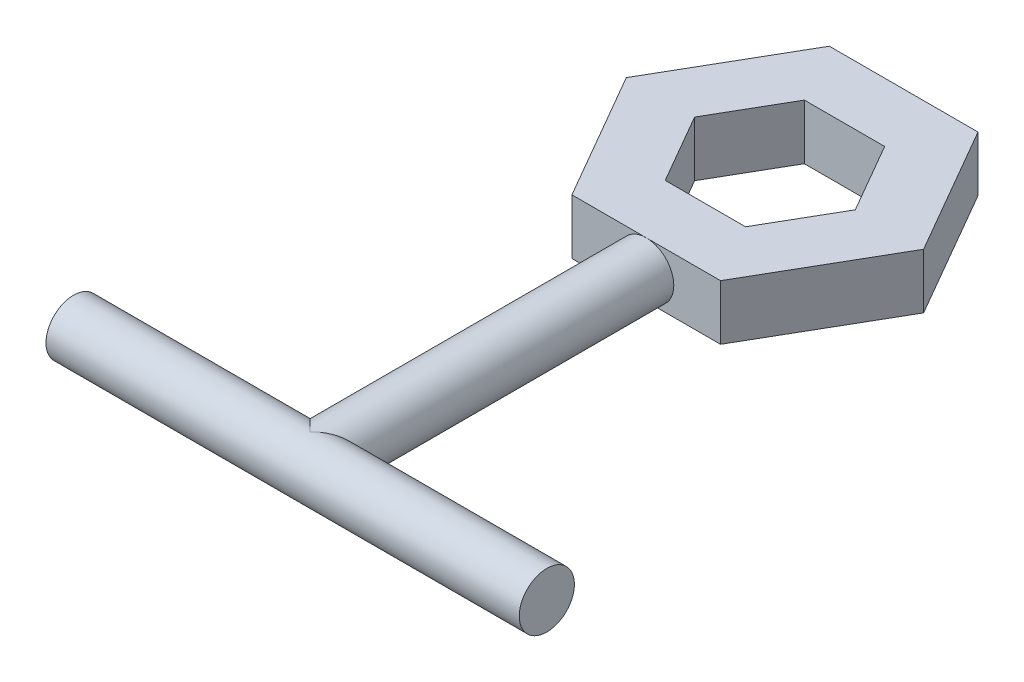
ISO-10303-21;
HEADER;
FILE_DESCRIPTION(('STEP AP214'),'2;1');
FILE_NAME('part.step','',(''),(''),'','','');
FILE_SCHEMA(('AUTOMOTIVE_DESIGN { 1 0 10303 214 1 1 1 1 }'));
ENDSEC;
DATA;
#1=APPLICATION_CONTEXT('core data for automotive mechanical design processes');
#2=APPLICATION_PROTOCOL_DEFINITION('international standard','automotive_design',2000,#1);
#3=PRODUCT_CONTEXT('',#1,'mechanical');
#4=PRODUCT('Part','Part','',(#3));
#5=PRODUCT_RELATED_PRODUCT_CATEGORY('part','',(#4));
#6=PRODUCT_DEFINITION_FORMATION('','',#4);
#7=PRODUCT_DEFINITION_CONTEXT('part definition',#1,'design');
#8=PRODUCT_DEFINITION('design','',#6,#7);
#9=PRODUCT_DEFINITION_SHAPE('','',#8);
#10=(LENGTH_UNIT() NAMED_UNIT(*) SI_UNIT(.MILLI.,.METRE.));
#11=(NAMED_UNIT(*) PLANE_ANGLE_UNIT() SI_UNIT($,.RADIAN.));
#12=(NAMED_UNIT(*) SI_UNIT($,.STERADIAN.) SOLID_ANGLE_UNIT());
#13=UNCERTAINTY_MEASURE_WITH_UNIT(LENGTH_MEASURE(1.E-05),#10,'distance_accuracy_value','');
#14=(GEOMETRIC_REPRESENTATION_CONTEXT(3) GLOBAL_UNCERTAINTY_ASSIGNED_CONTEXT((#13)) GLOBAL_UNIT_ASSIGNED_CONTEXT((#10,
#11,#12)) REPRESENTATION_CONTEXT('',''));
#15=CARTESIAN_POINT('',(0.,0.,0.));
#16=DIRECTION('',(0.,0.,1.));
#17=DIRECTION('',(1.,0.,0.));
#18=AXIS2_PLACEMENT_3D('',#15,#16,#17);
#19=CARTESIAN_POINT('',(-7.97759507955459,2.9591,13.8176));
#20=DIRECTION('',(0.,0.,-1.));
#21=DIRECTION('',(-1.,0.,0.));
#22=AXIS2_PLACEMENT_3D('',#19,#20,#21);
#23=PLANE('',#22);
#24=CARTESIAN_POINT('',(0.,0.,13.8176));
#25=DIRECTION('',(0.,0.,1.));
#26=DIRECTION('',(1.,0.,0.));
#27=AXIS2_PLACEMENT_3D('',#24,#25,#26);
#28=CIRCLE('',#27,2.9591);
#29=CARTESIAN_POINT('',(0.,2.9591,13.8176));
#30=VERTEX_POINT('',#29);
#31=CARTESIAN_POINT('',(0.,-2.9591,13.8176));
#32=VERTEX_POINT('',#31);
#33=EDGE_CURVE('E155',#30,#32,#28,.T.);
#34=ORIENTED_EDGE('',*,*,#33,.F.);
#35=DIRECTION('',(1.,0.,0.));
#36=VECTOR('',#35,1.);
#37=CARTESIAN_POINT('',(-7.97759507955459,2.9591,13.8176));
#38=LINE('',#37,#36);
#39=CARTESIAN_POINT('',(-7.97759507955459,2.9591,13.8176));
#40=VERTEX_POINT('',#39);
#41=EDGE_CURVE('E193',#40,#30,#38,.T.);
#42=ORIENTED_EDGE('',*,*,#41,.F.);
#43=DIRECTION('',(0.,-1.,0.));
#44=VECTOR('',#43,1.);
#45=CARTESIAN_POINT('',(-7.97759507955459,2.9591,13.8176));
#46=LINE('',#45,#44);
#47=CARTESIAN_POINT('',(-7.97759507955459,-2.9591,13.8176));
#48=VERTEX_POINT('',#47);
#49=EDGE_CURVE('E165',#40,#48,#46,.T.);
#50=ORIENTED_EDGE('',*,*,#49,.T.);
#51=DIRECTION('',(1.,0.,0.));
#52=VECTOR('',#51,1.);
#53=CARTESIAN_POINT('',(-7.97759507955459,-2.9591,13.8176));
#54=LINE('',#53,#52);
#55=EDGE_CURVE('E178',#48,#32,#54,.T.);
#56=ORIENTED_EDGE('',*,*,#55,.T.);
#57=EDGE_LOOP('',(#34,#42,#50,#56));
#58=FACE_BOUND('',#57,.T.);
#59=ADVANCED_FACE('F51',(#58),#23,.F.);
#60=CARTESIAN_POINT('',(0.,2.9591,0.));
#61=DIRECTION('',(0.,1.,0.));
#62=DIRECTION('',(0.,0.,1.));
#63=AXIS2_PLACEMENT_3D('',#60,#61,#62);
#64=PLANE('',#63);
#65=DIRECTION('',(-0.5,0.,-0.866025403784439));
#66=VECTOR('',#65,1.);
#67=CARTESIAN_POINT('',(15.9551901591092,2.9591,0.));
#68=LINE('',#67,#66);
#69=CARTESIAN_POINT('',(15.9551901591092,2.9591,0.));
#70=VERTEX_POINT('',#69);
#71=CARTESIAN_POINT('',(7.97759507955457,2.9591,-13.8176));
#72=VERTEX_POINT('',#71);
#73=EDGE_CURVE('E177',#70,#72,#68,.T.);
#74=ORIENTED_EDGE('',*,*,#73,.T.);
#75=DIRECTION('',(-1.,0.,0.));
#76=VECTOR('',#75,1.);
#77=CARTESIAN_POINT('',(7.97759507955457,2.9591,-13.8176));
#78=LINE('',#77,#76);
#79=CARTESIAN_POINT('',(-7.9775950795546,2.9591,-13.8176));
#80=VERTEX_POINT('',#79);
#81=EDGE_CURVE('E200',#72,#80,#78,.T.);
#82=ORIENTED_EDGE('',*,*,#81,.T.);
#83=DIRECTION('',(-0.5,0.,0.866025403784438));
#84=VECTOR('',#83,1.);
#85=CARTESIAN_POINT('',(-7.9775950795546,2.9591,-13.8176));
#86=LINE('',#85,#84);
#87=CARTESIAN_POINT('',(-15.9551901591092,2.9591,0.));
#88=VERTEX_POINT('',#87);
#89=EDGE_CURVE('E198',#80,#88,#86,.T.);
#90=ORIENTED_EDGE('',*,*,#89,.T.);
#91=DIRECTION('',(0.5,0.,0.866025403784439));
#92=VECTOR('',#91,1.);
#93=CARTESIAN_POINT('',(-15.9551901591092,2.9591,0.));
#94=LINE('',#93,#92);
#95=EDGE_CURVE('E196',#88,#40,#94,.T.);
#96=ORIENTED_EDGE('',*,*,#95,.T.);
#97=ORIENTED_EDGE('',*,*,#41,.T.);
#98=CARTESIAN_POINT('',(7.97759507955461,2.9591,13.8176));
#99=VERTEX_POINT('',#98);
#100=EDGE_CURVE('E195',#30,#99,#38,.T.);
#101=ORIENTED_EDGE('',*,*,#100,.T.);
#102=DIRECTION('',(0.5,0.,-0.866025403784439));
#103=VECTOR('',#102,1.);
#104=CARTESIAN_POINT('',(7.97759507955461,2.9591,13.8176));
#105=LINE('',#104,#103);
#106=EDGE_CURVE('E174',#99,#70,#105,.T.);
#107=ORIENTED_EDGE('',*,*,#106,.T.);
#108=EDGE_LOOP('',(#74,#82,#90,#96,#97,#101,#107));
#109=FACE_BOUND('',#108,.T.);
#110=DIRECTION('',(-0.500000000000001,0.,-0.866025403784438));
#111=VECTOR('',#110,1.);
#112=CARTESIAN_POINT('',(8.62284174040091,2.9591,0.));
#113=LINE('',#112,#111);
#114=CARTESIAN_POINT('',(8.62284174040091,2.9591,0.));
#115=VERTEX_POINT('',#114);
#116=CARTESIAN_POINT('',(4.31142087020044,2.9591,-7.46760000000002));
#117=VERTEX_POINT('',#116);
#118=EDGE_CURVE('E245',#115,#117,#113,.T.);
#119=ORIENTED_EDGE('',*,*,#118,.F.);
#120=DIRECTION('',(0.499999999999995,0.,-0.866025403784441));
#121=VECTOR('',#120,1.);
#122=CARTESIAN_POINT('',(4.31142087020054,2.9591,7.46759999999996));
#123=LINE('',#122,#121);
#124=CARTESIAN_POINT('',(4.31142087020054,2.9591,7.46759999999996));
#125=VERTEX_POINT('',#124);
#126=EDGE_CURVE('E221',#125,#115,#123,.T.);
#127=ORIENTED_EDGE('',*,*,#126,.F.);
#128=DIRECTION('',(1.,0.,0.));
#129=VECTOR('',#128,1.);
#130=CARTESIAN_POINT('',(-4.31142087020038,2.9591,7.46760000000004));
#131=LINE('',#130,#129);
#132=CARTESIAN_POINT('',(-4.31142087020038,2.9591,7.46760000000004));
#133=VERTEX_POINT('',#132);
#134=EDGE_CURVE('E217',#133,#125,#131,.T.);
#135=ORIENTED_EDGE('',*,*,#134,.F.);
#136=DIRECTION('',(0.500000000000007,0.,0.866025403784434));
#137=VECTOR('',#136,1.);
#138=CARTESIAN_POINT('',(-8.6228417404009,2.9591,0.));
#139=LINE('',#138,#137);
#140=CARTESIAN_POINT('',(-8.6228417404009,2.9591,0.));
#141=VERTEX_POINT('',#140);
#142=EDGE_CURVE('E238',#141,#133,#139,.T.);
#143=ORIENTED_EDGE('',*,*,#142,.F.);
#144=DIRECTION('',(-0.499999999999995,0.,0.866025403784441));
#145=VECTOR('',#144,1.);
#146=CARTESIAN_POINT('',(-4.31142087020049,2.9591,-7.46759999999999));
#147=LINE('',#146,#145);
#148=CARTESIAN_POINT('',(-4.31142087020049,2.9591,-7.46759999999999));
#149=VERTEX_POINT('',#148);
#150=EDGE_CURVE('E241',#149,#141,#147,.T.);
#151=ORIENTED_EDGE('',*,*,#150,.F.);
#152=DIRECTION('',(-1.,0.,0.));
#153=VECTOR('',#152,1.);
#154=CARTESIAN_POINT('',(4.31142087020044,2.9591,-7.46760000000002));
#155=LINE('',#154,#153);
#156=EDGE_CURVE('E243',#117,#149,#155,.T.);
#157=ORIENTED_EDGE('',*,*,#156,.F.);
#158=EDGE_LOOP('',(#119,#127,#135,#143,#151,#157));
#159=FACE_BOUND('',#158,.T.);
#160=ADVANCED_FACE('F270',(#109,#159),#64,.T.);
#161=CARTESIAN_POINT('',(0.,-2.9591,0.));
#162=DIRECTION('',(0.,1.,0.));
#163=DIRECTION('',(0.,0.,1.));
#164=AXIS2_PLACEMENT_3D('',#161,#162,#163);
#165=PLANE('',#164);
#166=DIRECTION('',(-0.5,0.,-0.866025403784439));
#167=VECTOR('',#166,1.);
#168=CARTESIAN_POINT('',(15.9551901591092,-2.9591,0.));
#169=LINE('',#168,#167);
#170=CARTESIAN_POINT('',(15.9551901591092,-2.9591,0.));
#171=VERTEX_POINT('',#170);
#172=CARTESIAN_POINT('',(7.97759507955457,-2.9591,-13.8176));
#173=VERTEX_POINT('',#172);
#174=EDGE_CURVE('E188',#171,#173,#169,.T.);
#175=ORIENTED_EDGE('',*,*,#174,.F.);
#176=DIRECTION('',(0.5,0.,-0.866025403784439));
#177=VECTOR('',#176,1.);
#178=CARTESIAN_POINT('',(7.97759507955461,-2.9591,13.8176));
#179=LINE('',#178,#177);
#180=CARTESIAN_POINT('',(7.97759507955461,-2.9591,13.8176));
#181=VERTEX_POINT('',#180);
#182=EDGE_CURVE('E175',#181,#171,#179,.T.);
#183=ORIENTED_EDGE('',*,*,#182,.F.);
#184=EDGE_CURVE('E181',#32,#181,#54,.T.);
#185=ORIENTED_EDGE('',*,*,#184,.F.);
#186=ORIENTED_EDGE('',*,*,#55,.F.);
#187=DIRECTION('',(0.5,0.,0.866025403784439));
#188=VECTOR('',#187,1.);
#189=CARTESIAN_POINT('',(-15.9551901591092,-2.9591,0.));
#190=LINE('',#189,#188);
#191=CARTESIAN_POINT('',(-15.9551901591092,-2.9591,0.));
#192=VERTEX_POINT('',#191);
#193=EDGE_CURVE('E182',#192,#48,#190,.T.);
#194=ORIENTED_EDGE('',*,*,#193,.F.);
#195=DIRECTION('',(-0.5,0.,0.866025403784438));
#196=VECTOR('',#195,1.);
#197=CARTESIAN_POINT('',(-7.9775950795546,-2.9591,-13.8176));
#198=LINE('',#197,#196);
#199=CARTESIAN_POINT('',(-7.9775950795546,-2.9591,-13.8176));
#200=VERTEX_POINT('',#199);
#201=EDGE_CURVE('E184',#200,#192,#198,.T.);
#202=ORIENTED_EDGE('',*,*,#201,.F.);
#203=DIRECTION('',(-1.,0.,0.));
#204=VECTOR('',#203,1.);
#205=CARTESIAN_POINT('',(7.97759507955457,-2.9591,-13.8176));
#206=LINE('',#205,#204);
#207=EDGE_CURVE('E186',#173,#200,#206,.T.);
#208=ORIENTED_EDGE('',*,*,#207,.F.);
#209=EDGE_LOOP('',(#175,#183,#185,#186,#194,#202,#208));
#210=FACE_BOUND('',#209,.T.);
#211=DIRECTION('',(0.499999999999995,0.,-0.866025403784441));
#212=VECTOR('',#211,1.);
#213=CARTESIAN_POINT('',(4.31142087020054,-2.9591,7.46759999999996));
#214=LINE('',#213,#212);
#215=CARTESIAN_POINT('',(4.31142087020054,-2.9591,7.46759999999996));
#216=VERTEX_POINT('',#215);
#217=CARTESIAN_POINT('',(8.62284174040091,-2.9591,0.));
#218=VERTEX_POINT('',#217);
#219=EDGE_CURVE('E234',#216,#218,#214,.T.);
#220=ORIENTED_EDGE('',*,*,#219,.T.);
#221=DIRECTION('',(-0.500000000000001,0.,-0.866025403784438));
#222=VECTOR('',#221,1.);
#223=CARTESIAN_POINT('',(8.62284174040091,-2.9591,0.));
#224=LINE('',#223,#222);
#225=CARTESIAN_POINT('',(4.31142087020044,-2.9591,-7.46760000000002));
#226=VERTEX_POINT('',#225);
#227=EDGE_CURVE('E231',#218,#226,#224,.T.);
#228=ORIENTED_EDGE('',*,*,#227,.T.);
#229=DIRECTION('',(-1.,0.,0.));
#230=VECTOR('',#229,1.);
#231=CARTESIAN_POINT('',(4.31142087020044,-2.9591,-7.46760000000002));
#232=LINE('',#231,#230);
#233=CARTESIAN_POINT('',(-4.31142087020049,-2.9591,-7.46759999999999));
#234=VERTEX_POINT('',#233);
#235=EDGE_CURVE('E228',#226,#234,#232,.T.);
#236=ORIENTED_EDGE('',*,*,#235,.T.);
#237=DIRECTION('',(-0.499999999999995,0.,0.866025403784441));
#238=VECTOR('',#237,1.);
#239=CARTESIAN_POINT('',(-4.31142087020049,-2.9591,-7.46759999999999));
#240=LINE('',#239,#238);
#241=CARTESIAN_POINT('',(-8.6228417404009,-2.9591,0.));
#242=VERTEX_POINT('',#241);
#243=EDGE_CURVE('E225',#234,#242,#240,.T.);
#244=ORIENTED_EDGE('',*,*,#243,.T.);
#245=DIRECTION('',(0.500000000000007,0.,0.866025403784434));
#246=VECTOR('',#245,1.);
#247=CARTESIAN_POINT('',(-8.6228417404009,-2.9591,0.));
#248=LINE('',#247,#246);
#249=CARTESIAN_POINT('',(-4.31142087020038,-2.9591,7.46760000000004));
#250=VERTEX_POINT('',#249);
#251=EDGE_CURVE('E222',#242,#250,#248,.T.);
#252=ORIENTED_EDGE('',*,*,#251,.T.);
#253=DIRECTION('',(1.,0.,0.));
#254=VECTOR('',#253,1.);
#255=CARTESIAN_POINT('',(-4.31142087020038,-2.9591,7.46760000000004));
#256=LINE('',#255,#254);
#257=EDGE_CURVE('E218',#250,#216,#256,.T.);
#258=ORIENTED_EDGE('',*,*,#257,.T.);
#259=EDGE_LOOP('',(#220,#228,#236,#244,#252,#258));
#260=FACE_BOUND('',#259,.T.);
#261=ADVANCED_FACE('F277',(#210,#260),#165,.F.);
#262=CARTESIAN_POINT('',(15.9551901591092,2.9591,0.));
#263=DIRECTION('',(-0.866025403784439,0.,0.5));
#264=DIRECTION('',(0.5,0.,0.866025403784439));
#265=AXIS2_PLACEMENT_3D('',#262,#263,#264);
#266=PLANE('',#265);
#267=ORIENTED_EDGE('',*,*,#174,.T.);
#268=DIRECTION('',(0.,-1.,0.));
#269=VECTOR('',#268,1.);
#270=CARTESIAN_POINT('',(7.97759507955457,2.9591,-13.8176));
#271=LINE('',#270,#269);
#272=EDGE_CURVE('E153',#72,#173,#271,.T.);
#273=ORIENTED_EDGE('',*,*,#272,.F.);
#274=ORIENTED_EDGE('',*,*,#73,.F.);
#275=DIRECTION('',(0.,-1.,0.));
#276=VECTOR('',#275,1.);
#277=CARTESIAN_POINT('',(15.9551901591092,2.9591,0.));
#278=LINE('',#277,#276);
#279=EDGE_CURVE('E171',#70,#171,#278,.T.);
#280=ORIENTED_EDGE('',*,*,#279,.T.);
#281=EDGE_LOOP('',(#267,#273,#274,#280));
#282=FACE_BOUND('',#281,.T.);
#283=ADVANCED_FACE('F53',(#282),#266,.F.);
#284=CARTESIAN_POINT('',(7.97759507955457,2.9591,-13.8176));
#285=DIRECTION('',(0.,0.,1.));
#286=DIRECTION('',(1.,0.,0.));
#287=AXIS2_PLACEMENT_3D('',#284,#285,#286);
#288=PLANE('',#287);
#289=ORIENTED_EDGE('',*,*,#207,.T.);
#290=DIRECTION('',(0.,-1.,0.));
#291=VECTOR('',#290,1.);
#292=CARTESIAN_POINT('',(-7.9775950795546,2.9591,-13.8176));
#293=LINE('',#292,#291);
#294=EDGE_CURVE('E159',#80,#200,#293,.T.);
#295=ORIENTED_EDGE('',*,*,#294,.F.);
#296=ORIENTED_EDGE('',*,*,#81,.F.);
#297=ORIENTED_EDGE('',*,*,#272,.T.);
#298=EDGE_LOOP('',(#289,#295,#296,#297));
#299=FACE_BOUND('',#298,.T.);
#300=ADVANCED_FACE('F297',(#299),#288,.F.);
#301=CARTESIAN_POINT('',(-7.9775950795546,2.9591,-13.8176));
#302=DIRECTION('',(0.866025403784439,0.,0.5));
#303=DIRECTION('',(0.5,0.,-0.866025403784439));
#304=AXIS2_PLACEMENT_3D('',#301,#302,#303);
#305=PLANE('',#304);
#306=ORIENTED_EDGE('',*,*,#201,.T.);
#307=DIRECTION('',(0.,-1.,0.));
#308=VECTOR('',#307,1.);
#309=CARTESIAN_POINT('',(-15.9551901591092,2.9591,0.));
#310=LINE('',#309,#308);
#311=EDGE_CURVE('E162',#88,#192,#310,.T.);
#312=ORIENTED_EDGE('',*,*,#311,.F.);
#313=ORIENTED_EDGE('',*,*,#89,.F.);
#314=ORIENTED_EDGE('',*,*,#294,.T.);
#315=EDGE_LOOP('',(#306,#312,#313,#314));
#316=FACE_BOUND('',#315,.T.);
#317=ADVANCED_FACE('F292',(#316),#305,.F.);
#318=CARTESIAN_POINT('',(-15.9551901591092,2.9591,0.));
#319=DIRECTION('',(0.866025403784439,0.,-0.5));
#320=DIRECTION('',(-0.5,0.,-0.866025403784439));
#321=AXIS2_PLACEMENT_3D('',#318,#319,#320);
#322=PLANE('',#321);
#323=ORIENTED_EDGE('',*,*,#193,.T.);
#324=ORIENTED_EDGE('',*,*,#49,.F.);
#325=ORIENTED_EDGE('',*,*,#95,.F.);
#326=ORIENTED_EDGE('',*,*,#311,.T.);
#327=EDGE_LOOP('',(#323,#324,#325,#326));
#328=FACE_BOUND('',#327,.T.);
#329=ADVANCED_FACE('F285',(#328),#322,.F.);
#330=EDGE_CURVE('E71',#32,#30,#28,.T.);
#331=ORIENTED_EDGE('',*,*,#330,.F.);
#332=ORIENTED_EDGE('',*,*,#184,.T.);
#333=DIRECTION('',(0.,-1.,0.));
#334=VECTOR('',#333,1.);
#335=CARTESIAN_POINT('',(7.97759507955461,2.9591,13.8176));
#336=LINE('',#335,#334);
#337=EDGE_CURVE('E168',#99,#181,#336,.T.);
#338=ORIENTED_EDGE('',*,*,#337,.F.);
#339=ORIENTED_EDGE('',*,*,#100,.F.);
#340=EDGE_LOOP('',(#331,#332,#338,#339));
#341=FACE_BOUND('',#340,.T.);
#342=ADVANCED_FACE('F273',(#341),#23,.F.);
#343=CARTESIAN_POINT('',(7.97759507955461,2.9591,13.8176));
#344=DIRECTION('',(-0.866025403784439,0.,-0.5));
#345=DIRECTION('',(-0.5,0.,0.866025403784439));
#346=AXIS2_PLACEMENT_3D('',#343,#344,#345);
#347=PLANE('',#346);
#348=ORIENTED_EDGE('',*,*,#182,.T.);
#349=ORIENTED_EDGE('',*,*,#279,.F.);
#350=ORIENTED_EDGE('',*,*,#106,.F.);
#351=ORIENTED_EDGE('',*,*,#337,.T.);
#352=EDGE_LOOP('',(#348,#349,#350,#351));
#353=FACE_BOUND('',#352,.T.);
#354=ADVANCED_FACE('F284',(#353),#347,.F.);
#355=CARTESIAN_POINT('',(4.31142087020054,2.9591,7.46759999999996));
#356=DIRECTION('',(-0.866025403784442,0.,-0.499999999999995));
#357=DIRECTION('',(-0.499999999999995,0.,0.866025403784442));
#358=AXIS2_PLACEMENT_3D('',#355,#356,#357);
#359=PLANE('',#358);
#360=ORIENTED_EDGE('',*,*,#219,.F.);
#361=DIRECTION('',(0.,-1.,0.));
#362=VECTOR('',#361,1.);
#363=CARTESIAN_POINT('',(4.31142087020054,2.9591,7.46759999999996));
#364=LINE('',#363,#362);
#365=EDGE_CURVE('E214',#125,#216,#364,.T.);
#366=ORIENTED_EDGE('',*,*,#365,.F.);
#367=ORIENTED_EDGE('',*,*,#126,.T.);
#368=DIRECTION('',(0.,-1.,0.));
#369=VECTOR('',#368,1.);
#370=CARTESIAN_POINT('',(8.62284174040091,2.9591,0.));
#371=LINE('',#370,#369);
#372=EDGE_CURVE('E191',#115,#218,#371,.T.);
#373=ORIENTED_EDGE('',*,*,#372,.T.);
#374=EDGE_LOOP('',(#360,#366,#367,#373));
#375=FACE_BOUND('',#374,.T.);
#376=ADVANCED_FACE('F290',(#375),#359,.T.);
#377=CARTESIAN_POINT('',(8.62284174040091,2.9591,0.));
#378=DIRECTION('',(-0.866025403784438,0.,0.500000000000001));
#379=DIRECTION('',(0.500000000000001,0.,0.866025403784438));
#380=AXIS2_PLACEMENT_3D('',#377,#378,#379);
#381=PLANE('',#380);
#382=ORIENTED_EDGE('',*,*,#227,.F.);
#383=ORIENTED_EDGE('',*,*,#372,.F.);
#384=ORIENTED_EDGE('',*,*,#118,.T.);
#385=DIRECTION('',(0.,-1.,0.));
#386=VECTOR('',#385,1.);
#387=CARTESIAN_POINT('',(4.31142087020044,2.9591,-7.46760000000002));
#388=LINE('',#387,#386);
#389=EDGE_CURVE('E206',#117,#226,#388,.T.);
#390=ORIENTED_EDGE('',*,*,#389,.T.);
#391=EDGE_LOOP('',(#382,#383,#384,#390));
#392=FACE_BOUND('',#391,.T.);
#393=ADVANCED_FACE('F333',(#392),#381,.T.);
#394=CARTESIAN_POINT('',(4.31142087020044,2.9591,-7.46760000000002));
#395=DIRECTION('',(0.,0.,1.));
#396=DIRECTION('',(1.,0.,0.));
#397=AXIS2_PLACEMENT_3D('',#394,#395,#396);
#398=PLANE('',#397);
#399=ORIENTED_EDGE('',*,*,#235,.F.);
#400=ORIENTED_EDGE('',*,*,#389,.F.);
#401=ORIENTED_EDGE('',*,*,#156,.T.);
#402=DIRECTION('',(0.,-1.,0.));
#403=VECTOR('',#402,1.);
#404=CARTESIAN_POINT('',(-4.31142087020049,2.9591,-7.46759999999999));
#405=LINE('',#404,#403);
#406=EDGE_CURVE('E208',#149,#234,#405,.T.);
#407=ORIENTED_EDGE('',*,*,#406,.T.);
#408=EDGE_LOOP('',(#399,#400,#401,#407));
#409=FACE_BOUND('',#408,.T.);
#410=ADVANCED_FACE('F336',(#409),#398,.T.);
#411=CARTESIAN_POINT('',(-4.31142087020049,2.9591,-7.46759999999999));
#412=DIRECTION('',(0.866025403784442,0.,0.499999999999995));
#413=DIRECTION('',(0.499999999999995,0.,-0.866025403784442));
#414=AXIS2_PLACEMENT_3D('',#411,#412,#413);
#415=PLANE('',#414);
#416=ORIENTED_EDGE('',*,*,#243,.F.);
#417=ORIENTED_EDGE('',*,*,#406,.F.);
#418=ORIENTED_EDGE('',*,*,#150,.T.);
#419=DIRECTION('',(0.,-1.,0.));
#420=VECTOR('',#419,1.);
#421=CARTESIAN_POINT('',(-8.6228417404009,2.9591,0.));
#422=LINE('',#421,#420);
#423=EDGE_CURVE('E210',#141,#242,#422,.T.);
#424=ORIENTED_EDGE('',*,*,#423,.T.);
#425=EDGE_LOOP('',(#416,#417,#418,#424));
#426=FACE_BOUND('',#425,.T.);
#427=ADVANCED_FACE('F349',(#426),#415,.T.);
#428=CARTESIAN_POINT('',(-8.6228417404009,2.9591,0.));
#429=DIRECTION('',(0.866025403784435,0.,-0.500000000000007));
#430=DIRECTION('',(-0.500000000000007,0.,-0.866025403784435));
#431=AXIS2_PLACEMENT_3D('',#428,#429,#430);
#432=PLANE('',#431);
#433=ORIENTED_EDGE('',*,*,#251,.F.);
#434=ORIENTED_EDGE('',*,*,#423,.F.);
#435=ORIENTED_EDGE('',*,*,#142,.T.);
#436=DIRECTION('',(0.,-1.,0.));
#437=VECTOR('',#436,1.);
#438=CARTESIAN_POINT('',(-4.31142087020038,2.9591,7.46760000000004));
#439=LINE('',#438,#437);
#440=EDGE_CURVE('E212',#133,#250,#439,.T.);
#441=ORIENTED_EDGE('',*,*,#440,.T.);
#442=EDGE_LOOP('',(#433,#434,#435,#441));
#443=FACE_BOUND('',#442,.T.);
#444=ADVANCED_FACE('F346',(#443),#432,.T.);
#445=CARTESIAN_POINT('',(-4.31142087020038,2.9591,7.46760000000004));
#446=DIRECTION('',(0.,0.,-1.));
#447=DIRECTION('',(-1.,0.,0.));
#448=AXIS2_PLACEMENT_3D('',#445,#446,#447);
#449=PLANE('',#448);
#450=ORIENTED_EDGE('',*,*,#257,.F.);
#451=ORIENTED_EDGE('',*,*,#440,.F.);
#452=ORIENTED_EDGE('',*,*,#134,.T.);
#453=ORIENTED_EDGE('',*,*,#365,.T.);
#454=EDGE_LOOP('',(#450,#451,#452,#453));
#455=FACE_BOUND('',#454,.T.);
#456=ADVANCED_FACE('F267',(#455),#449,.T.);
#457=CARTESIAN_POINT('',(0.,0.,13.8176));
#458=DIRECTION('',(0.,0.,1.));
#459=DIRECTION('',(1.,0.,0.));
#460=AXIS2_PLACEMENT_3D('',#457,#458,#459);
#461=CYLINDRICAL_SURFACE('',#460,2.9591);
#462=CARTESIAN_POINT('',(0.,0.,49.8856));
#463=DIRECTION('',(-0.707106781186547,0.,0.707106781186548));
#464=DIRECTION('',(0.707106781186548,0.,0.707106781186547));
#465=AXIS2_PLACEMENT_3D('',#462,#463,#464);
#466=ELLIPSE('',#465,4.18479935241823,2.9591);
#467=CARTESIAN_POINT('',(0.,2.9591,49.8856));
#468=VERTEX_POINT('',#467);
#469=CARTESIAN_POINT('',(0.,-2.9591,49.8856));
#470=VERTEX_POINT('',#469);
#471=EDGE_CURVE('E12',#468,#470,#466,.T.);
#472=ORIENTED_EDGE('',*,*,#471,.F.);
#473=CARTESIAN_POINT('',(0.,0.,49.8856));
#474=DIRECTION('',(0.707106781186548,0.,0.707106781186547));
#475=DIRECTION('',(-0.707106781186547,0.,0.707106781186548));
#476=AXIS2_PLACEMENT_3D('',#473,#474,#475);
#477=ELLIPSE('',#476,4.18479935241823,2.9591);
#478=EDGE_CURVE('E59',#470,#468,#477,.T.);
#479=ORIENTED_EDGE('',*,*,#478,.F.);
#480=EDGE_LOOP('',(#472,#479));
#481=FACE_BOUND('',#480,.T.);
#482=ORIENTED_EDGE('',*,*,#33,.T.);
#483=ORIENTED_EDGE('',*,*,#330,.T.);
#484=EDGE_LOOP('',(#482,#483));
#485=FACE_BOUND('',#484,.T.);
#486=ADVANCED_FACE('F148',(#481,#485),#461,.T.);
#487=CARTESIAN_POINT('',(25.4,0.,49.8856));
#488=DIRECTION('',(-1.,0.,0.));
#489=DIRECTION('',(0.,0.,1.));
#490=AXIS2_PLACEMENT_3D('',#487,#488,#489);
#491=PLANE('',#490);
#492=CARTESIAN_POINT('',(25.4,0.,49.8856));
#493=DIRECTION('',(-1.,0.,0.));
#494=DIRECTION('',(0.,0.,1.));
#495=AXIS2_PLACEMENT_3D('',#492,#493,#494);
#496=CIRCLE('',#495,2.9591);
#497=CARTESIAN_POINT('',(25.4,0.,52.8447));
#498=VERTEX_POINT('',#497);
#499=EDGE_CURVE('E252',#498,#498,#496,.T.);
#500=ORIENTED_EDGE('',*,*,#499,.F.);
#501=EDGE_LOOP('',(#500));
#502=FACE_BOUND('',#501,.T.);
#503=ADVANCED_FACE('F257',(#502),#491,.F.);
#504=CARTESIAN_POINT('',(-25.4,0.,49.8856000000001));
#505=DIRECTION('',(-1.,0.,0.));
#506=DIRECTION('',(0.,0.,1.));
#507=AXIS2_PLACEMENT_3D('',#504,#505,#506);
#508=PLANE('',#507);
#509=CARTESIAN_POINT('',(-25.4,0.,49.8856000000001));
#510=DIRECTION('',(-1.,0.,0.));
#511=DIRECTION('',(0.,0.,1.));
#512=AXIS2_PLACEMENT_3D('',#509,#510,#511);
#513=CIRCLE('',#512,2.9591);
#514=CARTESIAN_POINT('',(-25.4,0.,52.8447000000001));
#515=VERTEX_POINT('',#514);
#516=EDGE_CURVE('E249',#515,#515,#513,.T.);
#517=ORIENTED_EDGE('',*,*,#516,.T.);
#518=EDGE_LOOP('',(#517));
#519=FACE_BOUND('',#518,.T.);
#520=ADVANCED_FACE('F259',(#519),#508,.T.);
#521=CARTESIAN_POINT('',(25.4,0.,49.8856));
#522=DIRECTION('',(-1.,0.,0.));
#523=DIRECTION('',(0.,0.,1.));
#524=AXIS2_PLACEMENT_3D('',#521,#522,#523);
#525=CYLINDRICAL_SURFACE('',#524,2.9591);
#526=ORIENTED_EDGE('',*,*,#478,.T.);
#527=ORIENTED_EDGE('',*,*,#471,.T.);
#528=EDGE_LOOP('',(#526,#527));
#529=FACE_BOUND('',#528,.T.);
#530=ORIENTED_EDGE('',*,*,#516,.F.);
#531=EDGE_LOOP('',(#530));
#532=FACE_BOUND('',#531,.T.);
#533=ORIENTED_EDGE('',*,*,#499,.T.);
#534=EDGE_LOOP('',(#533));
#535=FACE_BOUND('',#534,.T.);
#536=ADVANCED_FACE('F151',(#529,#532,#535),#525,.T.);
#537=CLOSED_SHELL('',(#59,#160,#261,#283,#300,#317,#329,#342,#354,#376,#393,#410,#427,#444,#456,
#486,#503,#520,#536));
#538=MANIFOLD_SOLID_BREP('B2',#537);
#539=ADVANCED_BREP_SHAPE_REPRESENTATION('',(#18,#538),#14);
#540=SHAPE_DEFINITION_REPRESENTATION(#9,#539);
ENDSEC;
END-ISO-10303-21;
